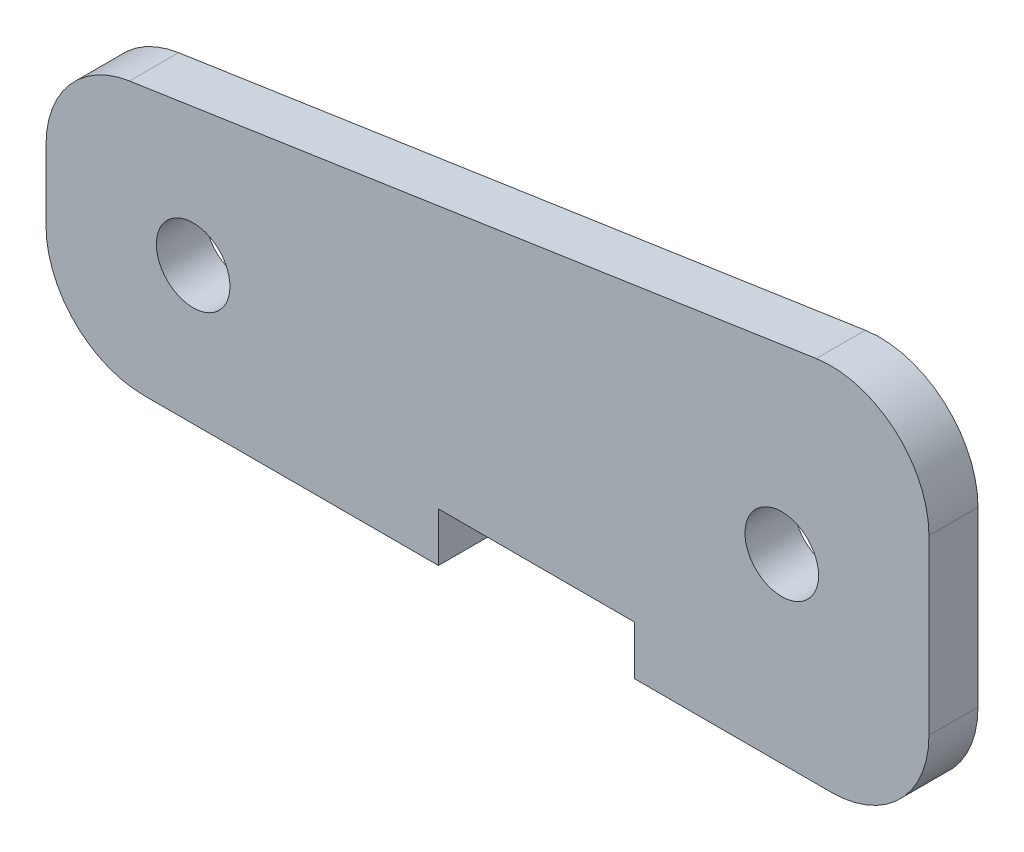
ISO-10303-21;
HEADER;
FILE_DESCRIPTION(('STEP AP214'),'2;1');
FILE_NAME('part.step','',(''),(''),'','','');
FILE_SCHEMA(('AUTOMOTIVE_DESIGN { 1 0 10303 214 1 1 1 1 }'));
ENDSEC;
DATA;
#1=APPLICATION_CONTEXT('core data for automotive mechanical design processes');
#2=APPLICATION_PROTOCOL_DEFINITION('international standard','automotive_design',2000,#1);
#3=PRODUCT_CONTEXT('',#1,'mechanical');
#4=PRODUCT('Part','Part','',(#3));
#5=PRODUCT_RELATED_PRODUCT_CATEGORY('part','',(#4));
#6=PRODUCT_DEFINITION_FORMATION('','',#4);
#7=PRODUCT_DEFINITION_CONTEXT('part definition',#1,'design');
#8=PRODUCT_DEFINITION('design','',#6,#7);
#9=PRODUCT_DEFINITION_SHAPE('','',#8);
#10=(LENGTH_UNIT() NAMED_UNIT(*) SI_UNIT(.MILLI.,.METRE.));
#11=(NAMED_UNIT(*) PLANE_ANGLE_UNIT() SI_UNIT($,.RADIAN.));
#12=(NAMED_UNIT(*) SI_UNIT($,.STERADIAN.) SOLID_ANGLE_UNIT());
#13=UNCERTAINTY_MEASURE_WITH_UNIT(LENGTH_MEASURE(1.E-05),#10,'distance_accuracy_value','');
#14=(GEOMETRIC_REPRESENTATION_CONTEXT(3) GLOBAL_UNCERTAINTY_ASSIGNED_CONTEXT((#13)) GLOBAL_UNIT_ASSIGNED_CONTEXT((#10,
#11,#12)) REPRESENTATION_CONTEXT('',''));
#15=CARTESIAN_POINT('',(0.,0.,0.));
#16=DIRECTION('',(0.,0.,1.));
#17=DIRECTION('',(1.,0.,0.));
#18=AXIS2_PLACEMENT_3D('',#15,#16,#17);
#19=CARTESIAN_POINT('',(-263.525,17.5502098778702,3.175));
#20=DIRECTION('',(0.,0.,-1.));
#21=DIRECTION('',(-1.,0.,0.));
#22=AXIS2_PLACEMENT_3D('',#19,#20,#21);
#23=CYLINDRICAL_SURFACE('',#22,6.35000000000001);
#24=CARTESIAN_POINT('',(-263.525,17.5502098778702,0.));
#25=DIRECTION('',(0.,0.,1.));
#26=DIRECTION('',(1.,0.,0.));
#27=AXIS2_PLACEMENT_3D('',#24,#25,#26);
#28=CIRCLE('',#27,6.35000000000001);
#29=CARTESIAN_POINT('',(-257.175,17.5502098778702,0.));
#30=VERTEX_POINT('',#29);
#31=CARTESIAN_POINT('',(-264.466961876107,23.8299557185839,0.));
#32=VERTEX_POINT('',#31);
#33=EDGE_CURVE('E160',#30,#32,#28,.T.);
#34=ORIENTED_EDGE('',*,*,#33,.T.);
#35=DIRECTION('',(0.,0.,-1.));
#36=VECTOR('',#35,1.);
#37=CARTESIAN_POINT('',(-264.466961876107,23.8299557185839,3.175));
#38=LINE('',#37,#36);
#39=CARTESIAN_POINT('',(-264.466961876107,23.8299557185839,3.175));
#40=VERTEX_POINT('',#39);
#41=EDGE_CURVE('E11',#40,#32,#38,.T.);
#42=ORIENTED_EDGE('',*,*,#41,.F.);
#43=CARTESIAN_POINT('',(-263.525,17.5502098778702,3.175));
#44=DIRECTION('',(0.,0.,1.));
#45=DIRECTION('',(1.,0.,0.));
#46=AXIS2_PLACEMENT_3D('',#43,#44,#45);
#47=CIRCLE('',#46,6.35000000000001);
#48=CARTESIAN_POINT('',(-257.175,17.5502098778702,3.175));
#49=VERTEX_POINT('',#48);
#50=EDGE_CURVE('E100',#49,#40,#47,.T.);
#51=ORIENTED_EDGE('',*,*,#50,.F.);
#52=DIRECTION('',(0.,0.,-1.));
#53=VECTOR('',#52,1.);
#54=CARTESIAN_POINT('',(-257.175,17.5502098778702,3.175));
#55=LINE('',#54,#53);
#56=EDGE_CURVE('E51',#49,#30,#55,.T.);
#57=ORIENTED_EDGE('',*,*,#56,.T.);
#58=EDGE_LOOP('',(#34,#42,#51,#57));
#59=FACE_BOUND('',#58,.T.);
#60=ADVANCED_FACE('F35',(#59),#23,.T.);
#61=CARTESIAN_POINT('',(-9.3154034229829,62.1026894865526,3.175));
#62=DIRECTION('',(-0.148340452930245,0.988936352868297,0.));
#63=DIRECTION('',(-0.988936352868298,-0.148340452930245,0.));
#64=AXIS2_PLACEMENT_3D('',#61,#62,#63);
#65=PLANE('',#64);
#66=DIRECTION('',(0.988936352868298,0.148340452930245,0.));
#67=VECTOR('',#66,1.);
#68=CARTESIAN_POINT('',(-9.3154034229829,62.1026894865526,0.));
#69=LINE('',#68,#67);
#70=CARTESIAN_POINT('',(-308.916961876107,17.1624557185839,0.));
#71=VERTEX_POINT('',#70);
#72=EDGE_CURVE('E162',#71,#32,#69,.T.);
#73=ORIENTED_EDGE('',*,*,#72,.F.);
#74=DIRECTION('',(0.,0.,-1.));
#75=VECTOR('',#74,1.);
#76=CARTESIAN_POINT('',(-308.916961876107,17.1624557185839,3.175));
#77=LINE('',#76,#75);
#78=CARTESIAN_POINT('',(-308.916961876107,17.1624557185839,3.175));
#79=VERTEX_POINT('',#78);
#80=EDGE_CURVE('E43',#79,#71,#77,.T.);
#81=ORIENTED_EDGE('',*,*,#80,.F.);
#82=DIRECTION('',(0.988936352868298,0.148340452930245,0.));
#83=VECTOR('',#82,1.);
#84=CARTESIAN_POINT('',(-9.3154034229829,62.1026894865526,3.175));
#85=LINE('',#84,#83);
#86=EDGE_CURVE('E271',#79,#40,#85,.T.);
#87=ORIENTED_EDGE('',*,*,#86,.T.);
#88=ORIENTED_EDGE('',*,*,#41,.T.);
#89=EDGE_LOOP('',(#73,#81,#87,#88));
#90=FACE_BOUND('',#89,.T.);
#91=ADVANCED_FACE('F221',(#90),#65,.T.);
#92=CARTESIAN_POINT('',(-307.975,10.8827098778702,3.175));
#93=DIRECTION('',(0.,0.,-1.));
#94=DIRECTION('',(-1.,0.,0.));
#95=AXIS2_PLACEMENT_3D('',#92,#93,#94);
#96=CYLINDRICAL_SURFACE('',#95,6.35000000000001);
#97=CARTESIAN_POINT('',(-307.975,10.8827098778702,0.));
#98=DIRECTION('',(0.,0.,1.));
#99=DIRECTION('',(1.,0.,0.));
#100=AXIS2_PLACEMENT_3D('',#97,#98,#99);
#101=CIRCLE('',#100,6.35000000000001);
#102=CARTESIAN_POINT('',(-314.325,10.8827098778702,0.));
#103=VERTEX_POINT('',#102);
#104=EDGE_CURVE('E165',#103,#71,#101,.F.);
#105=ORIENTED_EDGE('',*,*,#104,.F.);
#106=DIRECTION('',(0.,0.,-1.));
#107=VECTOR('',#106,1.);
#108=CARTESIAN_POINT('',(-314.325,10.8827098778702,3.175));
#109=LINE('',#108,#107);
#110=CARTESIAN_POINT('',(-314.325,10.8827098778702,3.175));
#111=VERTEX_POINT('',#110);
#112=EDGE_CURVE('E211',#111,#103,#109,.T.);
#113=ORIENTED_EDGE('',*,*,#112,.F.);
#114=CARTESIAN_POINT('',(-307.975,10.8827098778702,3.175));
#115=DIRECTION('',(0.,0.,1.));
#116=DIRECTION('',(1.,0.,0.));
#117=AXIS2_PLACEMENT_3D('',#114,#115,#116);
#118=CIRCLE('',#117,6.35000000000001);
#119=EDGE_CURVE('E218',#111,#79,#118,.F.);
#120=ORIENTED_EDGE('',*,*,#119,.T.);
#121=ORIENTED_EDGE('',*,*,#80,.T.);
#122=EDGE_LOOP('',(#105,#113,#120,#121));
#123=FACE_BOUND('',#122,.T.);
#124=ADVANCED_FACE('F216',(#123),#96,.T.);
#125=CARTESIAN_POINT('',(-314.325,0.,3.175));
#126=DIRECTION('',(1.,0.,0.));
#127=DIRECTION('',(0.,0.,-1.));
#128=AXIS2_PLACEMENT_3D('',#125,#126,#127);
#129=PLANE('',#128);
#130=DIRECTION('',(0.,-1.,0.));
#131=VECTOR('',#130,1.);
#132=CARTESIAN_POINT('',(-314.325,0.,0.));
#133=LINE('',#132,#131);
#134=CARTESIAN_POINT('',(-314.325,6.35000000000001,0.));
#135=VERTEX_POINT('',#134);
#136=EDGE_CURVE('E168',#103,#135,#133,.T.);
#137=ORIENTED_EDGE('',*,*,#136,.T.);
#138=DIRECTION('',(0.,0.,-1.));
#139=VECTOR('',#138,1.);
#140=CARTESIAN_POINT('',(-314.325,6.35000000000001,3.175));
#141=LINE('',#140,#139);
#142=CARTESIAN_POINT('',(-314.325,6.35000000000001,3.175));
#143=VERTEX_POINT('',#142);
#144=EDGE_CURVE('E208',#143,#135,#141,.T.);
#145=ORIENTED_EDGE('',*,*,#144,.F.);
#146=DIRECTION('',(0.,-1.,0.));
#147=VECTOR('',#146,1.);
#148=CARTESIAN_POINT('',(-314.325,0.,3.175));
#149=LINE('',#148,#147);
#150=EDGE_CURVE('E239',#111,#143,#149,.T.);
#151=ORIENTED_EDGE('',*,*,#150,.F.);
#152=ORIENTED_EDGE('',*,*,#112,.T.);
#153=EDGE_LOOP('',(#137,#145,#151,#152));
#154=FACE_BOUND('',#153,.T.);
#155=ADVANCED_FACE('F229',(#154),#129,.F.);
#156=CARTESIAN_POINT('',(-307.975,6.34999999999996,3.175));
#157=DIRECTION('',(0.,0.,-1.));
#158=DIRECTION('',(-1.,0.,0.));
#159=AXIS2_PLACEMENT_3D('',#156,#157,#158);
#160=CYLINDRICAL_SURFACE('',#159,6.35000000000001);
#161=CARTESIAN_POINT('',(-307.975,6.34999999999996,0.));
#162=DIRECTION('',(0.,0.,1.));
#163=DIRECTION('',(1.,0.,0.));
#164=AXIS2_PLACEMENT_3D('',#161,#162,#163);
#165=CIRCLE('',#164,6.35000000000001);
#166=CARTESIAN_POINT('',(-307.975,0.,0.));
#167=VERTEX_POINT('',#166);
#168=EDGE_CURVE('E170',#135,#167,#165,.T.);
#169=ORIENTED_EDGE('',*,*,#168,.T.);
#170=DIRECTION('',(0.,0.,-1.));
#171=VECTOR('',#170,1.);
#172=CARTESIAN_POINT('',(-307.975,0.,3.175));
#173=LINE('',#172,#171);
#174=CARTESIAN_POINT('',(-307.975,0.,3.175));
#175=VERTEX_POINT('',#174);
#176=EDGE_CURVE('E206',#175,#167,#173,.T.);
#177=ORIENTED_EDGE('',*,*,#176,.F.);
#178=CARTESIAN_POINT('',(-307.975,6.34999999999996,3.175));
#179=DIRECTION('',(0.,0.,1.));
#180=DIRECTION('',(1.,0.,0.));
#181=AXIS2_PLACEMENT_3D('',#178,#179,#180);
#182=CIRCLE('',#181,6.35000000000001);
#183=EDGE_CURVE('E235',#143,#175,#182,.T.);
#184=ORIENTED_EDGE('',*,*,#183,.F.);
#185=ORIENTED_EDGE('',*,*,#144,.T.);
#186=EDGE_LOOP('',(#169,#177,#184,#185));
#187=FACE_BOUND('',#186,.T.);
#188=ADVANCED_FACE('F233',(#187),#160,.T.);
#189=CARTESIAN_POINT('',(0.,0.,3.175));
#190=DIRECTION('',(0.,-1.,0.));
#191=DIRECTION('',(1.,0.,0.));
#192=AXIS2_PLACEMENT_3D('',#189,#190,#191);
#193=PLANE('',#192);
#194=DIRECTION('',(-1.,0.,0.));
#195=VECTOR('',#194,1.);
#196=CARTESIAN_POINT('',(0.,0.,0.));
#197=LINE('',#196,#195);
#198=CARTESIAN_POINT('',(-288.925,0.,0.));
#199=VERTEX_POINT('',#198);
#200=EDGE_CURVE('E173',#199,#167,#197,.T.);
#201=ORIENTED_EDGE('',*,*,#200,.F.);
#202=DIRECTION('',(0.,0.,-1.));
#203=VECTOR('',#202,1.);
#204=CARTESIAN_POINT('',(-288.925,0.,3.175));
#205=LINE('',#204,#203);
#206=CARTESIAN_POINT('',(-288.925,0.,3.175));
#207=VERTEX_POINT('',#206);
#208=EDGE_CURVE('E204',#207,#199,#205,.T.);
#209=ORIENTED_EDGE('',*,*,#208,.F.);
#210=DIRECTION('',(-1.,0.,0.));
#211=VECTOR('',#210,1.);
#212=CARTESIAN_POINT('',(0.,0.,3.175));
#213=LINE('',#212,#211);
#214=EDGE_CURVE('E238',#207,#175,#213,.T.);
#215=ORIENTED_EDGE('',*,*,#214,.T.);
#216=ORIENTED_EDGE('',*,*,#176,.T.);
#217=EDGE_LOOP('',(#201,#209,#215,#216));
#218=FACE_BOUND('',#217,.T.);
#219=ADVANCED_FACE('F283',(#218),#193,.T.);
#220=CARTESIAN_POINT('',(-288.925,0.,3.175));
#221=DIRECTION('',(-1.,0.,0.));
#222=DIRECTION('',(0.,0.,1.));
#223=AXIS2_PLACEMENT_3D('',#220,#221,#222);
#224=PLANE('',#223);
#225=DIRECTION('',(0.,1.,0.));
#226=VECTOR('',#225,1.);
#227=CARTESIAN_POINT('',(-288.925,0.,0.));
#228=LINE('',#227,#226);
#229=CARTESIAN_POINT('',(-288.925,3.17499999999996,0.));
#230=VERTEX_POINT('',#229);
#231=EDGE_CURVE('E176',#199,#230,#228,.T.);
#232=ORIENTED_EDGE('',*,*,#231,.T.);
#233=DIRECTION('',(0.,0.,-1.));
#234=VECTOR('',#233,1.);
#235=CARTESIAN_POINT('',(-288.925,3.17499999999996,3.175));
#236=LINE('',#235,#234);
#237=CARTESIAN_POINT('',(-288.925,3.17499999999996,3.175));
#238=VERTEX_POINT('',#237);
#239=EDGE_CURVE('E201',#238,#230,#236,.T.);
#240=ORIENTED_EDGE('',*,*,#239,.F.);
#241=DIRECTION('',(0.,1.,0.));
#242=VECTOR('',#241,1.);
#243=CARTESIAN_POINT('',(-288.925,0.,3.175));
#244=LINE('',#243,#242);
#245=EDGE_CURVE('E241',#207,#238,#244,.T.);
#246=ORIENTED_EDGE('',*,*,#245,.F.);
#247=ORIENTED_EDGE('',*,*,#208,.T.);
#248=EDGE_LOOP('',(#232,#240,#246,#247));
#249=FACE_BOUND('',#248,.T.);
#250=ADVANCED_FACE('F286',(#249),#224,.F.);
#251=CARTESIAN_POINT('',(0.,3.175,3.175));
#252=DIRECTION('',(0.,1.,0.));
#253=DIRECTION('',(-1.,0.,0.));
#254=AXIS2_PLACEMENT_3D('',#251,#252,#253);
#255=PLANE('',#254);
#256=DIRECTION('',(1.,0.,0.));
#257=VECTOR('',#256,1.);
#258=CARTESIAN_POINT('',(0.,3.175,0.));
#259=LINE('',#258,#257);
#260=CARTESIAN_POINT('',(-276.225,3.17499999999996,0.));
#261=VERTEX_POINT('',#260);
#262=EDGE_CURVE('E178',#230,#261,#259,.T.);
#263=ORIENTED_EDGE('',*,*,#262,.T.);
#264=DIRECTION('',(0.,0.,-1.));
#265=VECTOR('',#264,1.);
#266=CARTESIAN_POINT('',(-276.225,3.17499999999996,3.175));
#267=LINE('',#266,#265);
#268=CARTESIAN_POINT('',(-276.225,3.17499999999996,3.175));
#269=VERTEX_POINT('',#268);
#270=EDGE_CURVE('E199',#269,#261,#267,.T.);
#271=ORIENTED_EDGE('',*,*,#270,.F.);
#272=DIRECTION('',(1.,0.,0.));
#273=VECTOR('',#272,1.);
#274=CARTESIAN_POINT('',(0.,3.175,3.175));
#275=LINE('',#274,#273);
#276=EDGE_CURVE('E247',#238,#269,#275,.T.);
#277=ORIENTED_EDGE('',*,*,#276,.F.);
#278=ORIENTED_EDGE('',*,*,#239,.T.);
#279=EDGE_LOOP('',(#263,#271,#277,#278));
#280=FACE_BOUND('',#279,.T.);
#281=ADVANCED_FACE('F290',(#280),#255,.F.);
#282=CARTESIAN_POINT('',(-276.225,0.,3.175));
#283=DIRECTION('',(-1.,0.,0.));
#284=DIRECTION('',(0.,0.,1.));
#285=AXIS2_PLACEMENT_3D('',#282,#283,#284);
#286=PLANE('',#285);
#287=DIRECTION('',(0.,1.,0.));
#288=VECTOR('',#287,1.);
#289=CARTESIAN_POINT('',(-276.225,0.,0.));
#290=LINE('',#289,#288);
#291=CARTESIAN_POINT('',(-276.225,0.,0.));
#292=VERTEX_POINT('',#291);
#293=EDGE_CURVE('E181',#292,#261,#290,.T.);
#294=ORIENTED_EDGE('',*,*,#293,.F.);
#295=DIRECTION('',(0.,0.,-1.));
#296=VECTOR('',#295,1.);
#297=CARTESIAN_POINT('',(-276.225,0.,3.175));
#298=LINE('',#297,#296);
#299=CARTESIAN_POINT('',(-276.225,0.,3.175));
#300=VERTEX_POINT('',#299);
#301=EDGE_CURVE('E138',#300,#292,#298,.T.);
#302=ORIENTED_EDGE('',*,*,#301,.F.);
#303=DIRECTION('',(0.,1.,0.));
#304=VECTOR('',#303,1.);
#305=CARTESIAN_POINT('',(-276.225,0.,3.175));
#306=LINE('',#305,#304);
#307=EDGE_CURVE('E146',#300,#269,#306,.T.);
#308=ORIENTED_EDGE('',*,*,#307,.T.);
#309=ORIENTED_EDGE('',*,*,#270,.T.);
#310=EDGE_LOOP('',(#294,#302,#308,#309));
#311=FACE_BOUND('',#310,.T.);
#312=ADVANCED_FACE('F250',(#311),#286,.T.);
#313=CARTESIAN_POINT('',(0.,0.,3.175));
#314=DIRECTION('',(0.,-1.,0.));
#315=DIRECTION('',(1.,0.,0.));
#316=AXIS2_PLACEMENT_3D('',#313,#314,#315);
#317=PLANE('',#316);
#318=DIRECTION('',(-1.,0.,0.));
#319=VECTOR('',#318,1.);
#320=CARTESIAN_POINT('',(0.,0.,0.));
#321=LINE('',#320,#319);
#322=CARTESIAN_POINT('',(-263.525,0.,0.));
#323=VERTEX_POINT('',#322);
#324=EDGE_CURVE('E134',#323,#292,#321,.T.);
#325=ORIENTED_EDGE('',*,*,#324,.F.);
#326=DIRECTION('',(0.,0.,-1.));
#327=VECTOR('',#326,1.);
#328=CARTESIAN_POINT('',(-263.525,0.,3.175));
#329=LINE('',#328,#327);
#330=CARTESIAN_POINT('',(-263.525,0.,3.175));
#331=VERTEX_POINT('',#330);
#332=EDGE_CURVE('E129',#331,#323,#329,.T.);
#333=ORIENTED_EDGE('',*,*,#332,.F.);
#334=DIRECTION('',(-1.,0.,0.));
#335=VECTOR('',#334,1.);
#336=CARTESIAN_POINT('',(0.,0.,3.175));
#337=LINE('',#336,#335);
#338=EDGE_CURVE('E132',#331,#300,#337,.T.);
#339=ORIENTED_EDGE('',*,*,#338,.T.);
#340=ORIENTED_EDGE('',*,*,#301,.T.);
#341=EDGE_LOOP('',(#325,#333,#339,#340));
#342=FACE_BOUND('',#341,.T.);
#343=ADVANCED_FACE('F131',(#342),#317,.T.);
#344=CARTESIAN_POINT('',(-263.525,6.34999999999997,3.175));
#345=DIRECTION('',(0.,0.,-1.));
#346=DIRECTION('',(-1.,0.,0.));
#347=AXIS2_PLACEMENT_3D('',#344,#345,#346);
#348=CYLINDRICAL_SURFACE('',#347,6.35000000000001);
#349=CARTESIAN_POINT('',(-263.525,6.34999999999997,0.));
#350=DIRECTION('',(0.,0.,1.));
#351=DIRECTION('',(1.,0.,0.));
#352=AXIS2_PLACEMENT_3D('',#349,#350,#351);
#353=CIRCLE('',#352,6.35000000000001);
#354=CARTESIAN_POINT('',(-257.175,6.35000000000001,0.));
#355=VERTEX_POINT('',#354);
#356=EDGE_CURVE('E185',#355,#323,#353,.F.);
#357=ORIENTED_EDGE('',*,*,#356,.F.);
#358=DIRECTION('',(0.,0.,-1.));
#359=VECTOR('',#358,1.);
#360=CARTESIAN_POINT('',(-257.175,6.35000000000001,3.175));
#361=LINE('',#360,#359);
#362=CARTESIAN_POINT('',(-257.175,6.35000000000001,3.175));
#363=VERTEX_POINT('',#362);
#364=EDGE_CURVE('E88',#363,#355,#361,.T.);
#365=ORIENTED_EDGE('',*,*,#364,.F.);
#366=CARTESIAN_POINT('',(-263.525,6.34999999999997,3.175));
#367=DIRECTION('',(0.,0.,1.));
#368=DIRECTION('',(1.,0.,0.));
#369=AXIS2_PLACEMENT_3D('',#366,#367,#368);
#370=CIRCLE('',#369,6.35000000000001);
#371=EDGE_CURVE('E144',#363,#331,#370,.F.);
#372=ORIENTED_EDGE('',*,*,#371,.T.);
#373=ORIENTED_EDGE('',*,*,#332,.T.);
#374=EDGE_LOOP('',(#357,#365,#372,#373));
#375=FACE_BOUND('',#374,.T.);
#376=ADVANCED_FACE('F148',(#375),#348,.T.);
#377=CARTESIAN_POINT('',(-304.8,8.88999999999905,3.175));
#378=DIRECTION('',(0.,0.,-1.));
#379=DIRECTION('',(-1.,0.,0.));
#380=AXIS2_PLACEMENT_3D('',#377,#378,#379);
#381=CYLINDRICAL_SURFACE('',#380,2.38125000000001);
#382=CARTESIAN_POINT('',(-304.8,8.88999999999905,3.175));
#383=DIRECTION('',(0.,0.,1.));
#384=DIRECTION('',(1.,0.,0.));
#385=AXIS2_PLACEMENT_3D('',#382,#383,#384);
#386=CIRCLE('',#385,2.38125000000001);
#387=CARTESIAN_POINT('',(-302.41875,8.88999999999905,3.175));
#388=VERTEX_POINT('',#387);
#389=EDGE_CURVE('E151',#388,#388,#386,.T.);
#390=ORIENTED_EDGE('',*,*,#389,.T.);
#391=EDGE_LOOP('',(#390));
#392=FACE_BOUND('',#391,.T.);
#393=CARTESIAN_POINT('',(-304.8,8.88999999999905,0.));
#394=DIRECTION('',(0.,0.,1.));
#395=DIRECTION('',(1.,0.,0.));
#396=AXIS2_PLACEMENT_3D('',#393,#394,#395);
#397=CIRCLE('',#396,2.38125000000001);
#398=CARTESIAN_POINT('',(-302.41875,8.88999999999905,0.));
#399=VERTEX_POINT('',#398);
#400=EDGE_CURVE('E190',#399,#399,#397,.T.);
#401=ORIENTED_EDGE('',*,*,#400,.F.);
#402=EDGE_LOOP('',(#401));
#403=FACE_BOUND('',#402,.T.);
#404=ADVANCED_FACE('F256',(#392,#403),#381,.F.);
#405=CARTESIAN_POINT('',(-257.175,0.,3.175));
#406=DIRECTION('',(1.,0.,0.));
#407=DIRECTION('',(0.,0.,-1.));
#408=AXIS2_PLACEMENT_3D('',#405,#406,#407);
#409=PLANE('',#408);
#410=DIRECTION('',(0.,-1.,0.));
#411=VECTOR('',#410,1.);
#412=CARTESIAN_POINT('',(-257.175,0.,0.));
#413=LINE('',#412,#411);
#414=EDGE_CURVE('E187',#30,#355,#413,.T.);
#415=ORIENTED_EDGE('',*,*,#414,.F.);
#416=ORIENTED_EDGE('',*,*,#56,.F.);
#417=DIRECTION('',(0.,-1.,0.));
#418=VECTOR('',#417,1.);
#419=CARTESIAN_POINT('',(-257.175,0.,3.175));
#420=LINE('',#419,#418);
#421=EDGE_CURVE('E149',#49,#363,#420,.T.);
#422=ORIENTED_EDGE('',*,*,#421,.T.);
#423=ORIENTED_EDGE('',*,*,#364,.T.);
#424=EDGE_LOOP('',(#415,#416,#422,#423));
#425=FACE_BOUND('',#424,.T.);
#426=ADVANCED_FACE('F253',(#425),#409,.T.);
#427=CARTESIAN_POINT('',(-266.7,11.7474999999992,3.175));
#428=DIRECTION('',(0.,0.,-1.));
#429=DIRECTION('',(-1.,0.,0.));
#430=AXIS2_PLACEMENT_3D('',#427,#428,#429);
#431=CYLINDRICAL_SURFACE('',#430,2.38125000000001);
#432=CARTESIAN_POINT('',(-266.7,11.7474999999992,3.175));
#433=DIRECTION('',(0.,0.,1.));
#434=DIRECTION('',(1.,0.,0.));
#435=AXIS2_PLACEMENT_3D('',#432,#433,#434);
#436=CIRCLE('',#435,2.38125000000001);
#437=CARTESIAN_POINT('',(-264.31875,11.7474999999992,3.175));
#438=VERTEX_POINT('',#437);
#439=EDGE_CURVE('E157',#438,#438,#436,.T.);
#440=ORIENTED_EDGE('',*,*,#439,.T.);
#441=EDGE_LOOP('',(#440));
#442=FACE_BOUND('',#441,.T.);
#443=CARTESIAN_POINT('',(-266.7,11.7474999999992,0.));
#444=DIRECTION('',(0.,0.,1.));
#445=DIRECTION('',(1.,0.,0.));
#446=AXIS2_PLACEMENT_3D('',#443,#444,#445);
#447=CIRCLE('',#446,2.38125000000001);
#448=CARTESIAN_POINT('',(-264.31875,11.7474999999992,0.));
#449=VERTEX_POINT('',#448);
#450=EDGE_CURVE('E193',#449,#449,#447,.T.);
#451=ORIENTED_EDGE('',*,*,#450,.F.);
#452=EDGE_LOOP('',(#451));
#453=FACE_BOUND('',#452,.T.);
#454=ADVANCED_FACE('F255',(#442,#453),#431,.F.);
#455=CARTESIAN_POINT('',(0.,0.,3.175));
#456=DIRECTION('',(0.,0.,1.));
#457=DIRECTION('',(1.,0.,0.));
#458=AXIS2_PLACEMENT_3D('',#455,#456,#457);
#459=PLANE('',#458);
#460=ORIENTED_EDGE('',*,*,#50,.T.);
#461=ORIENTED_EDGE('',*,*,#86,.F.);
#462=ORIENTED_EDGE('',*,*,#119,.F.);
#463=ORIENTED_EDGE('',*,*,#150,.T.);
#464=ORIENTED_EDGE('',*,*,#183,.T.);
#465=ORIENTED_EDGE('',*,*,#214,.F.);
#466=ORIENTED_EDGE('',*,*,#245,.T.);
#467=ORIENTED_EDGE('',*,*,#276,.T.);
#468=ORIENTED_EDGE('',*,*,#307,.F.);
#469=ORIENTED_EDGE('',*,*,#338,.F.);
#470=ORIENTED_EDGE('',*,*,#371,.F.);
#471=ORIENTED_EDGE('',*,*,#421,.F.);
#472=EDGE_LOOP('',(#460,#461,#462,#463,#464,#465,#466,#467,#468,#469,#470,#471));
#473=FACE_BOUND('',#472,.T.);
#474=ORIENTED_EDGE('',*,*,#389,.F.);
#475=EDGE_LOOP('',(#474));
#476=FACE_BOUND('',#475,.T.);
#477=ORIENTED_EDGE('',*,*,#439,.F.);
#478=EDGE_LOOP('',(#477));
#479=FACE_BOUND('',#478,.T.);
#480=ADVANCED_FACE('F142',(#473,#476,#479),#459,.T.);
#481=CARTESIAN_POINT('',(0.,0.,0.));
#482=DIRECTION('',(0.,0.,1.));
#483=DIRECTION('',(1.,0.,0.));
#484=AXIS2_PLACEMENT_3D('',#481,#482,#483);
#485=PLANE('',#484);
#486=ORIENTED_EDGE('',*,*,#33,.F.);
#487=ORIENTED_EDGE('',*,*,#414,.T.);
#488=ORIENTED_EDGE('',*,*,#356,.T.);
#489=ORIENTED_EDGE('',*,*,#324,.T.);
#490=ORIENTED_EDGE('',*,*,#293,.T.);
#491=ORIENTED_EDGE('',*,*,#262,.F.);
#492=ORIENTED_EDGE('',*,*,#231,.F.);
#493=ORIENTED_EDGE('',*,*,#200,.T.);
#494=ORIENTED_EDGE('',*,*,#168,.F.);
#495=ORIENTED_EDGE('',*,*,#136,.F.);
#496=ORIENTED_EDGE('',*,*,#104,.T.);
#497=ORIENTED_EDGE('',*,*,#72,.T.);
#498=EDGE_LOOP('',(#486,#487,#488,#489,#490,#491,#492,#493,#494,#495,#496,#497));
#499=FACE_BOUND('',#498,.T.);
#500=ORIENTED_EDGE('',*,*,#400,.T.);
#501=EDGE_LOOP('',(#500));
#502=FACE_BOUND('',#501,.T.);
#503=ORIENTED_EDGE('',*,*,#450,.T.);
#504=EDGE_LOOP('',(#503));
#505=FACE_BOUND('',#504,.T.);
#506=ADVANCED_FACE('F224',(#499,#502,#505),#485,.F.);
#507=CLOSED_SHELL('',(#60,#91,#124,#155,#188,#219,#250,#281,#312,#343,#376,#404,#426,#454,#480,#506));
#508=MANIFOLD_SOLID_BREP('B2',#507);
#509=ADVANCED_BREP_SHAPE_REPRESENTATION('',(#18,#508),#14);
#510=SHAPE_DEFINITION_REPRESENTATION(#9,#509);
ENDSEC;
END-ISO-10303-21;
